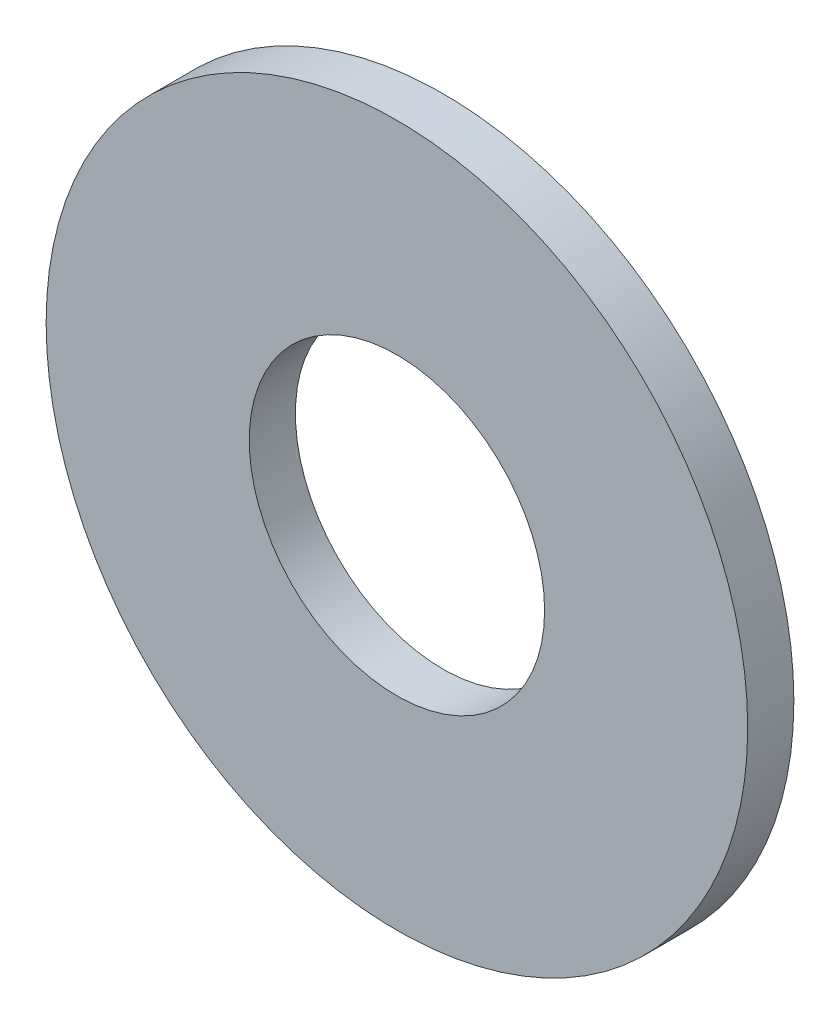
ISO-10303-21;
HEADER;
FILE_DESCRIPTION(('STEP AP214'),'2;1');
FILE_NAME('part.step','',(''),(''),'','','');
FILE_SCHEMA(('AUTOMOTIVE_DESIGN { 1 0 10303 214 1 1 1 1 }'));
ENDSEC;
DATA;
#1=APPLICATION_CONTEXT('core data for automotive mechanical design processes');
#2=APPLICATION_PROTOCOL_DEFINITION('international standard','automotive_design',2000,#1);
#3=PRODUCT_CONTEXT('',#1,'mechanical');
#4=PRODUCT('Part','Part','',(#3));
#5=PRODUCT_RELATED_PRODUCT_CATEGORY('part','',(#4));
#6=PRODUCT_DEFINITION_FORMATION('','',#4);
#7=PRODUCT_DEFINITION_CONTEXT('part definition',#1,'design');
#8=PRODUCT_DEFINITION('design','',#6,#7);
#9=PRODUCT_DEFINITION_SHAPE('','',#8);
#10=(LENGTH_UNIT() NAMED_UNIT(*) SI_UNIT(.MILLI.,.METRE.));
#11=(NAMED_UNIT(*) PLANE_ANGLE_UNIT() SI_UNIT($,.RADIAN.));
#12=(NAMED_UNIT(*) SI_UNIT($,.STERADIAN.) SOLID_ANGLE_UNIT());
#13=UNCERTAINTY_MEASURE_WITH_UNIT(LENGTH_MEASURE(1.E-05),#10,'distance_accuracy_value','');
#14=(GEOMETRIC_REPRESENTATION_CONTEXT(3) GLOBAL_UNCERTAINTY_ASSIGNED_CONTEXT((#13)) GLOBAL_UNIT_ASSIGNED_CONTEXT((#10,
#11,#12)) REPRESENTATION_CONTEXT('',''));
#15=CARTESIAN_POINT('',(0.,0.,0.));
#16=DIRECTION('',(0.,0.,1.));
#17=DIRECTION('',(1.,0.,0.));
#18=AXIS2_PLACEMENT_3D('',#15,#16,#17);
#19=CARTESIAN_POINT('',(2558.08250772888,2698.68678698311,0.635));
#20=DIRECTION('',(0.,0.,1.));
#21=DIRECTION('',(1.,0.,0.));
#22=AXIS2_PLACEMENT_3D('',#19,#20,#21);
#23=PLANE('',#22);
#24=CARTESIAN_POINT('',(2558.08250772888,2698.68678698311,0.635));
#25=DIRECTION('',(0.,0.,1.));
#26=DIRECTION('',(1.,0.,0.));
#27=AXIS2_PLACEMENT_3D('',#24,#25,#26);
#28=CIRCLE('',#27,4.826);
#29=CARTESIAN_POINT('',(2562.90850772888,2698.68678698311,0.635));
#30=VERTEX_POINT('',#29);
#31=EDGE_CURVE('E10',#30,#30,#28,.T.);
#32=ORIENTED_EDGE('',*,*,#31,.T.);
#33=EDGE_LOOP('',(#32));
#34=FACE_BOUND('',#33,.T.);
#35=CARTESIAN_POINT('',(2558.08250772888,2698.68678698311,0.635));
#36=DIRECTION('',(0.,0.,1.));
#37=DIRECTION('',(1.,0.,0.));
#38=AXIS2_PLACEMENT_3D('',#35,#36,#37);
#39=CIRCLE('',#38,2.03199999999981);
#40=CARTESIAN_POINT('',(2560.11450772888,2698.68678698311,0.635));
#41=VERTEX_POINT('',#40);
#42=EDGE_CURVE('E42',#41,#41,#39,.T.);
#43=ORIENTED_EDGE('',*,*,#42,.F.);
#44=EDGE_LOOP('',(#43));
#45=FACE_BOUND('',#44,.T.);
#46=ADVANCED_FACE('F31',(#34,#45),#23,.T.);
#47=CARTESIAN_POINT('',(2558.08250772888,2698.68678698311,0.));
#48=DIRECTION('',(0.,0.,1.));
#49=DIRECTION('',(1.,0.,0.));
#50=AXIS2_PLACEMENT_3D('',#47,#48,#49);
#51=PLANE('',#50);
#52=CARTESIAN_POINT('',(2558.08250772888,2698.68678698311,0.));
#53=DIRECTION('',(0.,0.,1.));
#54=DIRECTION('',(1.,0.,0.));
#55=AXIS2_PLACEMENT_3D('',#52,#53,#54);
#56=CIRCLE('',#55,4.826);
#57=CARTESIAN_POINT('',(2562.90850772888,2698.68678698311,0.));
#58=VERTEX_POINT('',#57);
#59=EDGE_CURVE('E35',#58,#58,#56,.T.);
#60=ORIENTED_EDGE('',*,*,#59,.F.);
#61=EDGE_LOOP('',(#60));
#62=FACE_BOUND('',#61,.T.);
#63=CARTESIAN_POINT('',(2558.08250772888,2698.68678698311,0.));
#64=DIRECTION('',(0.,0.,1.));
#65=DIRECTION('',(1.,0.,0.));
#66=AXIS2_PLACEMENT_3D('',#63,#64,#65);
#67=CIRCLE('',#66,2.03199999999981);
#68=CARTESIAN_POINT('',(2560.11450772888,2698.68678698311,0.));
#69=VERTEX_POINT('',#68);
#70=EDGE_CURVE('E44',#69,#69,#67,.T.);
#71=ORIENTED_EDGE('',*,*,#70,.T.);
#72=EDGE_LOOP('',(#71));
#73=FACE_BOUND('',#72,.T.);
#74=ADVANCED_FACE('F54',(#62,#73),#51,.F.);
#75=CARTESIAN_POINT('',(2558.08250772888,2698.68678698311,0.635));
#76=DIRECTION('',(0.,0.,-1.));
#77=DIRECTION('',(-1.,0.,0.));
#78=AXIS2_PLACEMENT_3D('',#75,#76,#77);
#79=CYLINDRICAL_SURFACE('',#78,4.826);
#80=ORIENTED_EDGE('',*,*,#31,.F.);
#81=EDGE_LOOP('',(#80));
#82=FACE_BOUND('',#81,.T.);
#83=ORIENTED_EDGE('',*,*,#59,.T.);
#84=EDGE_LOOP('',(#83));
#85=FACE_BOUND('',#84,.T.);
#86=ADVANCED_FACE('F33',(#82,#85),#79,.T.);
#87=CARTESIAN_POINT('',(2558.08250772888,2698.68678698311,0.635));
#88=DIRECTION('',(0.,0.,-1.));
#89=DIRECTION('',(-1.,0.,0.));
#90=AXIS2_PLACEMENT_3D('',#87,#88,#89);
#91=CYLINDRICAL_SURFACE('',#90,2.03199999999981);
#92=ORIENTED_EDGE('',*,*,#42,.T.);
#93=EDGE_LOOP('',(#92));
#94=FACE_BOUND('',#93,.T.);
#95=ORIENTED_EDGE('',*,*,#70,.F.);
#96=EDGE_LOOP('',(#95));
#97=FACE_BOUND('',#96,.T.);
#98=ADVANCED_FACE('F50',(#94,#97),#91,.F.);
#99=CLOSED_SHELL('',(#46,#74,#86,#98));
#100=MANIFOLD_SOLID_BREP('B2',#99);
#101=ADVANCED_BREP_SHAPE_REPRESENTATION('',(#18,#100),#14);
#102=SHAPE_DEFINITION_REPRESENTATION(#9,#101);
ENDSEC;
END-ISO-10303-21;
